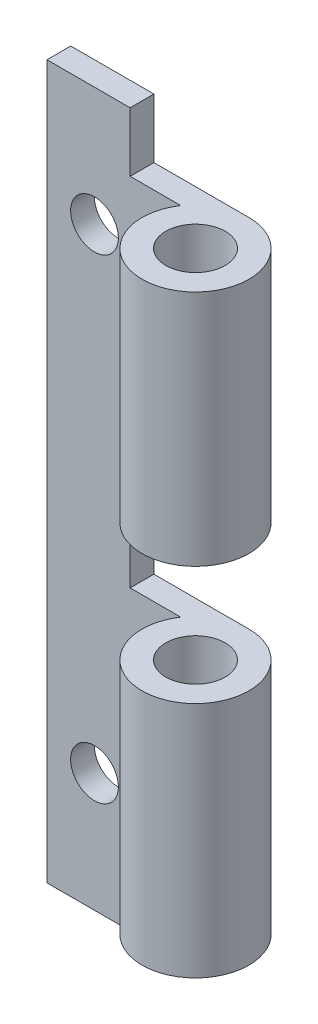
ISO-10303-21;
HEADER;
FILE_DESCRIPTION(('STEP AP214'),'2;1');
FILE_NAME('part.step','',(''),(''),'','','');
FILE_SCHEMA(('AUTOMOTIVE_DESIGN { 1 0 10303 214 1 1 1 1 }'));
ENDSEC;
DATA;
#1=APPLICATION_CONTEXT('core data for automotive mechanical design processes');
#2=APPLICATION_PROTOCOL_DEFINITION('international standard','automotive_design',2000,#1);
#3=PRODUCT_CONTEXT('',#1,'mechanical');
#4=PRODUCT('Part','Part','',(#3));
#5=PRODUCT_RELATED_PRODUCT_CATEGORY('part','',(#4));
#6=PRODUCT_DEFINITION_FORMATION('','',#4);
#7=PRODUCT_DEFINITION_CONTEXT('part definition',#1,'design');
#8=PRODUCT_DEFINITION('design','',#6,#7);
#9=PRODUCT_DEFINITION_SHAPE('','',#8);
#10=(LENGTH_UNIT() NAMED_UNIT(*) SI_UNIT(.MILLI.,.METRE.));
#11=(NAMED_UNIT(*) PLANE_ANGLE_UNIT() SI_UNIT($,.RADIAN.));
#12=(NAMED_UNIT(*) SI_UNIT($,.STERADIAN.) SOLID_ANGLE_UNIT());
#13=UNCERTAINTY_MEASURE_WITH_UNIT(LENGTH_MEASURE(1.E-05),#10,'distance_accuracy_value','');
#14=(GEOMETRIC_REPRESENTATION_CONTEXT(3) GLOBAL_UNCERTAINTY_ASSIGNED_CONTEXT((#13)) GLOBAL_UNIT_ASSIGNED_CONTEXT((#10,
#11,#12)) REPRESENTATION_CONTEXT('',''));
#15=CARTESIAN_POINT('',(0.,0.,0.));
#16=DIRECTION('',(0.,0.,1.));
#17=DIRECTION('',(1.,0.,0.));
#18=AXIS2_PLACEMENT_3D('',#15,#16,#17);
#19=CARTESIAN_POINT('',(0.,0.,0.));
#20=DIRECTION('',(0.,0.,1.));
#21=DIRECTION('',(1.,0.,0.));
#22=AXIS2_PLACEMENT_3D('',#19,#20,#21);
#23=PLANE('',#22);
#24=DIRECTION('',(1.,0.,0.));
#25=VECTOR('',#24,1.);
#26=CARTESIAN_POINT('',(-10.16,6.35,0.));
#27=LINE('',#26,#25);
#28=CARTESIAN_POINT('',(-10.16,6.35,0.));
#29=VERTEX_POINT('',#28);
#30=CARTESIAN_POINT('',(0.,6.35,0.));
#31=VERTEX_POINT('',#30);
#32=EDGE_CURVE('E142',#29,#31,#27,.T.);
#33=ORIENTED_EDGE('',*,*,#32,.F.);
#34=DIRECTION('',(0.,1.,0.));
#35=VECTOR('',#34,1.);
#36=CARTESIAN_POINT('',(-10.16,6.35,0.));
#37=LINE('',#36,#35);
#38=CARTESIAN_POINT('',(-10.16,0.,0.));
#39=VERTEX_POINT('',#38);
#40=EDGE_CURVE('E150',#39,#29,#37,.T.);
#41=ORIENTED_EDGE('',*,*,#40,.F.);
#42=DIRECTION('',(1.,0.,0.));
#43=VECTOR('',#42,1.);
#44=CARTESIAN_POINT('',(0.,0.,0.));
#45=LINE('',#44,#43);
#46=CARTESIAN_POINT('',(-19.05,0.,0.));
#47=VERTEX_POINT('',#46);
#48=EDGE_CURVE('E241',#47,#39,#45,.T.);
#49=ORIENTED_EDGE('',*,*,#48,.F.);
#50=DIRECTION('',(0.,-1.,0.));
#51=VECTOR('',#50,1.);
#52=CARTESIAN_POINT('',(-19.05,0.,0.));
#53=LINE('',#52,#51);
#54=CARTESIAN_POINT('',(-19.05,76.2,0.));
#55=VERTEX_POINT('',#54);
#56=EDGE_CURVE('E253',#55,#47,#53,.T.);
#57=ORIENTED_EDGE('',*,*,#56,.F.);
#58=DIRECTION('',(-1.,0.,0.));
#59=VECTOR('',#58,1.);
#60=CARTESIAN_POINT('',(0.,76.2,0.));
#61=LINE('',#60,#59);
#62=CARTESIAN_POINT('',(-10.16,76.2,0.));
#63=VERTEX_POINT('',#62);
#64=EDGE_CURVE('E70',#63,#55,#61,.T.);
#65=ORIENTED_EDGE('',*,*,#64,.F.);
#66=DIRECTION('',(0.,1.,0.));
#67=VECTOR('',#66,1.);
#68=CARTESIAN_POINT('',(-10.16,69.85,0.));
#69=LINE('',#68,#67);
#70=CARTESIAN_POINT('',(-10.16,69.85,0.));
#71=VERTEX_POINT('',#70);
#72=EDGE_CURVE('E169',#71,#63,#69,.T.);
#73=ORIENTED_EDGE('',*,*,#72,.F.);
#74=DIRECTION('',(-1.,0.,0.));
#75=VECTOR('',#74,1.);
#76=CARTESIAN_POINT('',(-10.16,69.85,0.));
#77=LINE('',#76,#75);
#78=CARTESIAN_POINT('',(0.,69.85,0.));
#79=VERTEX_POINT('',#78);
#80=EDGE_CURVE('E172',#79,#71,#77,.T.);
#81=ORIENTED_EDGE('',*,*,#80,.F.);
#82=DIRECTION('',(0.,1.,0.));
#83=VECTOR('',#82,1.);
#84=CARTESIAN_POINT('',(0.,0.,0.));
#85=LINE('',#84,#83);
#86=CARTESIAN_POINT('',(0.,44.45,0.));
#87=VERTEX_POINT('',#86);
#88=EDGE_CURVE('E247',#87,#79,#85,.T.);
#89=ORIENTED_EDGE('',*,*,#88,.F.);
#90=DIRECTION('',(1.,0.,0.));
#91=VECTOR('',#90,1.);
#92=CARTESIAN_POINT('',(-10.16,44.45,0.));
#93=LINE('',#92,#91);
#94=CARTESIAN_POINT('',(-10.16,44.45,0.));
#95=VERTEX_POINT('',#94);
#96=EDGE_CURVE('E186',#95,#87,#93,.T.);
#97=ORIENTED_EDGE('',*,*,#96,.F.);
#98=DIRECTION('',(0.,1.,0.));
#99=VECTOR('',#98,1.);
#100=CARTESIAN_POINT('',(-10.16,31.75,0.));
#101=LINE('',#100,#99);
#102=CARTESIAN_POINT('',(-10.16,31.75,0.));
#103=VERTEX_POINT('',#102);
#104=EDGE_CURVE('E182',#103,#95,#101,.T.);
#105=ORIENTED_EDGE('',*,*,#104,.F.);
#106=DIRECTION('',(-1.,0.,0.));
#107=VECTOR('',#106,1.);
#108=CARTESIAN_POINT('',(-10.16,31.75,0.));
#109=LINE('',#108,#107);
#110=CARTESIAN_POINT('',(0.,31.75,0.));
#111=VERTEX_POINT('',#110);
#112=EDGE_CURVE('E191',#111,#103,#109,.T.);
#113=ORIENTED_EDGE('',*,*,#112,.F.);
#114=EDGE_CURVE('E161',#31,#111,#85,.T.);
#115=ORIENTED_EDGE('',*,*,#114,.F.);
#116=EDGE_LOOP('',(#33,#41,#49,#57,#65,#73,#81,#89,#97,#105,#113,#115));
#117=FACE_BOUND('',#116,.T.);
#118=CARTESIAN_POINT('',(-13.97,12.7,0.));
#119=DIRECTION('',(0.,0.,1.));
#120=DIRECTION('',(1.,0.,0.));
#121=AXIS2_PLACEMENT_3D('',#118,#119,#120);
#122=CIRCLE('',#121,2.55269999999999);
#123=CARTESIAN_POINT('',(-11.4173,12.7,0.));
#124=VERTEX_POINT('',#123);
#125=EDGE_CURVE('E187',#124,#124,#122,.F.);
#126=ORIENTED_EDGE('',*,*,#125,.F.);
#127=EDGE_LOOP('',(#126));
#128=FACE_BOUND('',#127,.T.);
#129=CARTESIAN_POINT('',(-13.97,63.5,0.));
#130=DIRECTION('',(0.,0.,1.));
#131=DIRECTION('',(1.,0.,0.));
#132=AXIS2_PLACEMENT_3D('',#129,#130,#131);
#133=CIRCLE('',#132,2.55269999999999);
#134=CARTESIAN_POINT('',(-11.4173,63.5,0.));
#135=VERTEX_POINT('',#134);
#136=EDGE_CURVE('E356',#135,#135,#133,.F.);
#137=ORIENTED_EDGE('',*,*,#136,.F.);
#138=EDGE_LOOP('',(#137));
#139=FACE_BOUND('',#138,.T.);
#140=ADVANCED_FACE('F39',(#117,#128,#139),#23,.F.);
#141=CARTESIAN_POINT('',(0.,92.3644610179245,5.715));
#142=DIRECTION('',(0.,-1.,0.));
#143=DIRECTION('',(0.,0.,-1.));
#144=AXIS2_PLACEMENT_3D('',#141,#142,#143);
#145=CYLINDRICAL_SURFACE('',#144,5.715);
#146=CARTESIAN_POINT('',(0.,69.85,5.715));
#147=DIRECTION('',(0.,-1.,0.));
#148=DIRECTION('',(0.,0.,-1.));
#149=AXIS2_PLACEMENT_3D('',#146,#147,#148);
#150=CIRCLE('',#149,5.715);
#151=CARTESIAN_POINT('',(-4.7519048812029,69.85,2.54));
#152=VERTEX_POINT('',#151);
#153=EDGE_CURVE('E214',#152,#79,#150,.F.);
#154=ORIENTED_EDGE('',*,*,#153,.F.);
#155=DIRECTION('',(0.,-1.,0.));
#156=VECTOR('',#155,1.);
#157=CARTESIAN_POINT('',(-4.7519048812029,92.3644610179245,2.54));
#158=LINE('',#157,#156);
#159=CARTESIAN_POINT('',(-4.7519048812029,44.45,2.54));
#160=VERTEX_POINT('',#159);
#161=EDGE_CURVE('E237',#152,#160,#158,.T.);
#162=ORIENTED_EDGE('',*,*,#161,.T.);
#163=CARTESIAN_POINT('',(0.,44.45,5.715));
#164=DIRECTION('',(0.,1.,0.));
#165=DIRECTION('',(-1.,0.,0.));
#166=AXIS2_PLACEMENT_3D('',#163,#164,#165);
#167=CIRCLE('',#166,5.715);
#168=EDGE_CURVE('E200',#87,#160,#167,.F.);
#169=ORIENTED_EDGE('',*,*,#168,.F.);
#170=ORIENTED_EDGE('',*,*,#88,.T.);
#171=EDGE_LOOP('',(#154,#162,#169,#170));
#172=FACE_BOUND('',#171,.T.);
#173=ADVANCED_FACE('F290',(#172),#145,.T.);
#174=CARTESIAN_POINT('',(0.,76.2,2.54));
#175=DIRECTION('',(0.,-1.,0.));
#176=DIRECTION('',(1.,0.,0.));
#177=AXIS2_PLACEMENT_3D('',#174,#175,#176);
#178=PLANE('',#177);
#179=DIRECTION('',(-1.,0.,0.));
#180=VECTOR('',#179,1.);
#181=CARTESIAN_POINT('',(0.,76.2,2.54));
#182=LINE('',#181,#180);
#183=CARTESIAN_POINT('',(-10.16,76.2,2.54));
#184=VERTEX_POINT('',#183);
#185=CARTESIAN_POINT('',(-19.05,76.2,2.54));
#186=VERTEX_POINT('',#185);
#187=EDGE_CURVE('E238',#184,#186,#182,.T.);
#188=ORIENTED_EDGE('',*,*,#187,.F.);
#189=DIRECTION('',(0.,0.,-1.));
#190=VECTOR('',#189,1.);
#191=CARTESIAN_POINT('',(-10.16,76.2,11.43));
#192=LINE('',#191,#190);
#193=EDGE_CURVE('E177',#184,#63,#192,.T.);
#194=ORIENTED_EDGE('',*,*,#193,.T.);
#195=ORIENTED_EDGE('',*,*,#64,.T.);
#196=DIRECTION('',(0.,0.,-1.));
#197=VECTOR('',#196,1.);
#198=CARTESIAN_POINT('',(-19.05,76.2,2.54));
#199=LINE('',#198,#197);
#200=EDGE_CURVE('E11',#186,#55,#199,.T.);
#201=ORIENTED_EDGE('',*,*,#200,.F.);
#202=EDGE_LOOP('',(#188,#194,#195,#201));
#203=FACE_BOUND('',#202,.T.);
#204=ADVANCED_FACE('F41',(#203),#178,.F.);
#205=CARTESIAN_POINT('',(-19.05,0.,2.54));
#206=DIRECTION('',(1.,0.,0.));
#207=DIRECTION('',(0.,0.,-1.));
#208=AXIS2_PLACEMENT_3D('',#205,#206,#207);
#209=PLANE('',#208);
#210=ORIENTED_EDGE('',*,*,#56,.T.);
#211=DIRECTION('',(0.,0.,-1.));
#212=VECTOR('',#211,1.);
#213=CARTESIAN_POINT('',(-19.05,0.,2.54));
#214=LINE('',#213,#212);
#215=CARTESIAN_POINT('',(-19.05,0.,2.54));
#216=VERTEX_POINT('',#215);
#217=EDGE_CURVE('E50',#216,#47,#214,.T.);
#218=ORIENTED_EDGE('',*,*,#217,.F.);
#219=DIRECTION('',(0.,-1.,0.));
#220=VECTOR('',#219,1.);
#221=CARTESIAN_POINT('',(-19.05,0.,2.54));
#222=LINE('',#221,#220);
#223=EDGE_CURVE('E59',#186,#216,#222,.T.);
#224=ORIENTED_EDGE('',*,*,#223,.F.);
#225=ORIENTED_EDGE('',*,*,#200,.T.);
#226=EDGE_LOOP('',(#210,#218,#224,#225));
#227=FACE_BOUND('',#226,.T.);
#228=ADVANCED_FACE('F303',(#227),#209,.F.);
#229=CARTESIAN_POINT('',(0.,0.,2.54));
#230=DIRECTION('',(0.,1.,0.));
#231=DIRECTION('',(-1.,0.,0.));
#232=AXIS2_PLACEMENT_3D('',#229,#230,#231);
#233=PLANE('',#232);
#234=ORIENTED_EDGE('',*,*,#48,.T.);
#235=DIRECTION('',(0.,0.,-1.));
#236=VECTOR('',#235,1.);
#237=CARTESIAN_POINT('',(-10.16,0.,11.43));
#238=LINE('',#237,#236);
#239=CARTESIAN_POINT('',(-10.16,0.,2.54));
#240=VERTEX_POINT('',#239);
#241=EDGE_CURVE('E147',#240,#39,#238,.T.);
#242=ORIENTED_EDGE('',*,*,#241,.F.);
#243=DIRECTION('',(1.,0.,0.));
#244=VECTOR('',#243,1.);
#245=CARTESIAN_POINT('',(0.,0.,2.54));
#246=LINE('',#245,#244);
#247=EDGE_CURVE('E244',#216,#240,#246,.T.);
#248=ORIENTED_EDGE('',*,*,#247,.F.);
#249=ORIENTED_EDGE('',*,*,#217,.T.);
#250=EDGE_LOOP('',(#234,#242,#248,#249));
#251=FACE_BOUND('',#250,.T.);
#252=ADVANCED_FACE('F301',(#251),#233,.F.);
#253=CARTESIAN_POINT('',(0.,0.,2.54));
#254=DIRECTION('',(0.,0.,1.));
#255=DIRECTION('',(1.,0.,0.));
#256=AXIS2_PLACEMENT_3D('',#253,#254,#255);
#257=PLANE('',#256);
#258=CARTESIAN_POINT('',(-13.97,63.5,2.54));
#259=DIRECTION('',(0.,0.,1.));
#260=DIRECTION('',(1.,0.,0.));
#261=AXIS2_PLACEMENT_3D('',#258,#259,#260);
#262=CIRCLE('',#261,2.55269999999999);
#263=CARTESIAN_POINT('',(-11.4173,63.5,2.54));
#264=VERTEX_POINT('',#263);
#265=EDGE_CURVE('E359',#264,#264,#262,.T.);
#266=ORIENTED_EDGE('',*,*,#265,.F.);
#267=EDGE_LOOP('',(#266));
#268=FACE_BOUND('',#267,.T.);
#269=CARTESIAN_POINT('',(-13.97,12.7,2.54));
#270=DIRECTION('',(0.,0.,1.));
#271=DIRECTION('',(1.,0.,0.));
#272=AXIS2_PLACEMENT_3D('',#269,#270,#271);
#273=CIRCLE('',#272,2.55269999999999);
#274=CARTESIAN_POINT('',(-11.4173,12.7,2.54));
#275=VERTEX_POINT('',#274);
#276=EDGE_CURVE('E364',#275,#275,#273,.T.);
#277=ORIENTED_EDGE('',*,*,#276,.F.);
#278=EDGE_LOOP('',(#277));
#279=FACE_BOUND('',#278,.T.);
#280=DIRECTION('',(0.,-1.,0.));
#281=VECTOR('',#280,1.);
#282=CARTESIAN_POINT('',(-10.16,0.,2.54));
#283=LINE('',#282,#281);
#284=CARTESIAN_POINT('',(-10.16,6.35,2.54));
#285=VERTEX_POINT('',#284);
#286=EDGE_CURVE('E78',#285,#240,#283,.T.);
#287=ORIENTED_EDGE('',*,*,#286,.F.);
#288=DIRECTION('',(-1.,0.,0.));
#289=VECTOR('',#288,1.);
#290=CARTESIAN_POINT('',(0.,6.35,2.54));
#291=LINE('',#290,#289);
#292=CARTESIAN_POINT('',(-4.7519048812029,6.35,2.54));
#293=VERTEX_POINT('',#292);
#294=EDGE_CURVE('E145',#293,#285,#291,.T.);
#295=ORIENTED_EDGE('',*,*,#294,.F.);
#296=CARTESIAN_POINT('',(-4.7519048812029,31.75,2.54));
#297=VERTEX_POINT('',#296);
#298=EDGE_CURVE('E233',#297,#293,#158,.T.);
#299=ORIENTED_EDGE('',*,*,#298,.F.);
#300=DIRECTION('',(1.,0.,0.));
#301=VECTOR('',#300,1.);
#302=CARTESIAN_POINT('',(0.,31.75,2.54));
#303=LINE('',#302,#301);
#304=CARTESIAN_POINT('',(-10.16,31.75,2.54));
#305=VERTEX_POINT('',#304);
#306=EDGE_CURVE('E210',#305,#297,#303,.T.);
#307=ORIENTED_EDGE('',*,*,#306,.F.);
#308=DIRECTION('',(0.,-1.,0.));
#309=VECTOR('',#308,1.);
#310=CARTESIAN_POINT('',(-10.16,0.,2.54));
#311=LINE('',#310,#309);
#312=CARTESIAN_POINT('',(-10.16,44.45,2.54));
#313=VERTEX_POINT('',#312);
#314=EDGE_CURVE('E225',#313,#305,#311,.T.);
#315=ORIENTED_EDGE('',*,*,#314,.F.);
#316=DIRECTION('',(-1.,0.,0.));
#317=VECTOR('',#316,1.);
#318=CARTESIAN_POINT('',(0.,44.45,2.54));
#319=LINE('',#318,#317);
#320=EDGE_CURVE('E203',#160,#313,#319,.T.);
#321=ORIENTED_EDGE('',*,*,#320,.F.);
#322=ORIENTED_EDGE('',*,*,#161,.F.);
#323=DIRECTION('',(1.,0.,0.));
#324=VECTOR('',#323,1.);
#325=CARTESIAN_POINT('',(0.,69.85,2.54));
#326=LINE('',#325,#324);
#327=CARTESIAN_POINT('',(-10.16,69.85,2.54));
#328=VERTEX_POINT('',#327);
#329=EDGE_CURVE('E217',#328,#152,#326,.T.);
#330=ORIENTED_EDGE('',*,*,#329,.F.);
#331=DIRECTION('',(0.,-1.,0.));
#332=VECTOR('',#331,1.);
#333=CARTESIAN_POINT('',(-10.16,0.,2.54));
#334=LINE('',#333,#332);
#335=EDGE_CURVE('E228',#184,#328,#334,.T.);
#336=ORIENTED_EDGE('',*,*,#335,.F.);
#337=ORIENTED_EDGE('',*,*,#187,.T.);
#338=ORIENTED_EDGE('',*,*,#223,.T.);
#339=ORIENTED_EDGE('',*,*,#247,.T.);
#340=EDGE_LOOP('',(#287,#295,#299,#307,#315,#321,#322,#330,#336,#337,#338,#339));
#341=FACE_BOUND('',#340,.T.);
#342=ADVANCED_FACE('F300',(#268,#279,#341),#257,.T.);
#343=CARTESIAN_POINT('',(0.,6.34999999999999,5.715));
#344=DIRECTION('',(0.,1.,0.));
#345=DIRECTION('',(-1.,0.,0.));
#346=AXIS2_PLACEMENT_3D('',#343,#344,#345);
#347=CIRCLE('',#346,5.715);
#348=EDGE_CURVE('E220',#31,#293,#347,.F.);
#349=ORIENTED_EDGE('',*,*,#348,.F.);
#350=ORIENTED_EDGE('',*,*,#114,.T.);
#351=CARTESIAN_POINT('',(0.,31.75,5.715));
#352=DIRECTION('',(0.,-1.,0.));
#353=DIRECTION('',(1.,0.,0.));
#354=AXIS2_PLACEMENT_3D('',#351,#352,#353);
#355=CIRCLE('',#354,5.715);
#356=EDGE_CURVE('E207',#297,#111,#355,.F.);
#357=ORIENTED_EDGE('',*,*,#356,.F.);
#358=ORIENTED_EDGE('',*,*,#298,.T.);
#359=EDGE_LOOP('',(#349,#350,#357,#358));
#360=FACE_BOUND('',#359,.T.);
#361=ADVANCED_FACE('F297',(#360),#145,.T.);
#362=CARTESIAN_POINT('',(-10.16,31.75,11.43));
#363=DIRECTION('',(0.,-1.,0.));
#364=DIRECTION('',(1.,0.,0.));
#365=AXIS2_PLACEMENT_3D('',#362,#363,#364);
#366=PLANE('',#365);
#367=ORIENTED_EDGE('',*,*,#306,.T.);
#368=ORIENTED_EDGE('',*,*,#356,.T.);
#369=ORIENTED_EDGE('',*,*,#112,.T.);
#370=DIRECTION('',(0.,0.,-1.));
#371=VECTOR('',#370,1.);
#372=CARTESIAN_POINT('',(-10.16,31.75,11.43));
#373=LINE('',#372,#371);
#374=EDGE_CURVE('E173',#305,#103,#373,.T.);
#375=ORIENTED_EDGE('',*,*,#374,.F.);
#376=EDGE_LOOP('',(#367,#368,#369,#375));
#377=FACE_BOUND('',#376,.T.);
#378=CARTESIAN_POINT('',(0.,31.75,5.715));
#379=DIRECTION('',(0.,-1.,0.));
#380=DIRECTION('',(1.,0.,0.));
#381=AXIS2_PLACEMENT_3D('',#378,#379,#380);
#382=CIRCLE('',#381,3.175);
#383=CARTESIAN_POINT('',(3.175,31.75,5.715));
#384=VERTEX_POINT('',#383);
#385=EDGE_CURVE('E206',#384,#384,#382,.F.);
#386=ORIENTED_EDGE('',*,*,#385,.F.);
#387=EDGE_LOOP('',(#386));
#388=FACE_BOUND('',#387,.T.);
#389=ADVANCED_FACE('F317',(#377,#388),#366,.F.);
#390=CARTESIAN_POINT('',(-10.16,44.45,11.43));
#391=DIRECTION('',(0.,1.,0.));
#392=DIRECTION('',(-1.,0.,0.));
#393=AXIS2_PLACEMENT_3D('',#390,#391,#392);
#394=PLANE('',#393);
#395=ORIENTED_EDGE('',*,*,#320,.T.);
#396=DIRECTION('',(0.,0.,-1.));
#397=VECTOR('',#396,1.);
#398=CARTESIAN_POINT('',(-10.16,44.45,11.43));
#399=LINE('',#398,#397);
#400=EDGE_CURVE('E195',#313,#95,#399,.T.);
#401=ORIENTED_EDGE('',*,*,#400,.T.);
#402=ORIENTED_EDGE('',*,*,#96,.T.);
#403=ORIENTED_EDGE('',*,*,#168,.T.);
#404=EDGE_LOOP('',(#395,#401,#402,#403));
#405=FACE_BOUND('',#404,.T.);
#406=CARTESIAN_POINT('',(0.,44.45,5.715));
#407=DIRECTION('',(0.,1.,0.));
#408=DIRECTION('',(-1.,0.,0.));
#409=AXIS2_PLACEMENT_3D('',#406,#407,#408);
#410=CIRCLE('',#409,3.175);
#411=CARTESIAN_POINT('',(-3.175,44.45,5.715));
#412=VERTEX_POINT('',#411);
#413=EDGE_CURVE('E167',#412,#412,#410,.F.);
#414=ORIENTED_EDGE('',*,*,#413,.F.);
#415=EDGE_LOOP('',(#414));
#416=FACE_BOUND('',#415,.T.);
#417=ADVANCED_FACE('F381',(#405,#416),#394,.F.);
#418=CARTESIAN_POINT('',(-10.16,31.75,11.43));
#419=DIRECTION('',(-1.,0.,0.));
#420=DIRECTION('',(0.,0.,1.));
#421=AXIS2_PLACEMENT_3D('',#418,#419,#420);
#422=PLANE('',#421);
#423=ORIENTED_EDGE('',*,*,#314,.T.);
#424=ORIENTED_EDGE('',*,*,#374,.T.);
#425=ORIENTED_EDGE('',*,*,#104,.T.);
#426=ORIENTED_EDGE('',*,*,#400,.F.);
#427=EDGE_LOOP('',(#423,#424,#425,#426));
#428=FACE_BOUND('',#427,.T.);
#429=ADVANCED_FACE('F285',(#428),#422,.F.);
#430=CARTESIAN_POINT('',(0.,92.3644610179245,5.715));
#431=DIRECTION('',(0.,-1.,0.));
#432=DIRECTION('',(0.,0.,-1.));
#433=AXIS2_PLACEMENT_3D('',#430,#431,#432);
#434=CYLINDRICAL_SURFACE('',#433,3.175);
#435=CARTESIAN_POINT('',(0.,6.34999999999999,5.715));
#436=DIRECTION('',(0.,1.,0.));
#437=DIRECTION('',(-1.,0.,0.));
#438=AXIS2_PLACEMENT_3D('',#435,#436,#437);
#439=CIRCLE('',#438,3.175);
#440=CARTESIAN_POINT('',(-3.175,6.34999999999999,5.715));
#441=VERTEX_POINT('',#440);
#442=EDGE_CURVE('E43',#441,#441,#439,.F.);
#443=ORIENTED_EDGE('',*,*,#442,.T.);
#444=EDGE_LOOP('',(#443));
#445=FACE_BOUND('',#444,.T.);
#446=ORIENTED_EDGE('',*,*,#385,.T.);
#447=EDGE_LOOP('',(#446));
#448=FACE_BOUND('',#447,.T.);
#449=ADVANCED_FACE('F276',(#445,#448),#434,.F.);
#450=CARTESIAN_POINT('',(-10.16,69.85,11.43));
#451=DIRECTION('',(0.,-1.,0.));
#452=DIRECTION('',(0.,0.,-1.));
#453=AXIS2_PLACEMENT_3D('',#450,#451,#452);
#454=PLANE('',#453);
#455=ORIENTED_EDGE('',*,*,#329,.T.);
#456=ORIENTED_EDGE('',*,*,#153,.T.);
#457=ORIENTED_EDGE('',*,*,#80,.T.);
#458=DIRECTION('',(0.,0.,-1.));
#459=VECTOR('',#458,1.);
#460=CARTESIAN_POINT('',(-10.16,69.85,11.43));
#461=LINE('',#460,#459);
#462=EDGE_CURVE('E156',#328,#71,#461,.T.);
#463=ORIENTED_EDGE('',*,*,#462,.F.);
#464=EDGE_LOOP('',(#455,#456,#457,#463));
#465=FACE_BOUND('',#464,.T.);
#466=CARTESIAN_POINT('',(0.,69.85,5.715));
#467=DIRECTION('',(0.,-1.,0.));
#468=DIRECTION('',(0.,0.,-1.));
#469=AXIS2_PLACEMENT_3D('',#466,#467,#468);
#470=CIRCLE('',#469,3.175);
#471=CARTESIAN_POINT('',(0.,69.85,2.54));
#472=VERTEX_POINT('',#471);
#473=EDGE_CURVE('E213',#472,#472,#470,.F.);
#474=ORIENTED_EDGE('',*,*,#473,.F.);
#475=EDGE_LOOP('',(#474));
#476=FACE_BOUND('',#475,.T.);
#477=ADVANCED_FACE('F273',(#465,#476),#454,.F.);
#478=CARTESIAN_POINT('',(-10.16,69.85,11.43));
#479=DIRECTION('',(-1.,0.,0.));
#480=DIRECTION('',(0.,0.,1.));
#481=AXIS2_PLACEMENT_3D('',#478,#479,#480);
#482=PLANE('',#481);
#483=ORIENTED_EDGE('',*,*,#335,.T.);
#484=ORIENTED_EDGE('',*,*,#462,.T.);
#485=ORIENTED_EDGE('',*,*,#72,.T.);
#486=ORIENTED_EDGE('',*,*,#193,.F.);
#487=EDGE_LOOP('',(#483,#484,#485,#486));
#488=FACE_BOUND('',#487,.T.);
#489=ADVANCED_FACE('F275',(#488),#482,.F.);
#490=CARTESIAN_POINT('',(-10.16,6.35,11.43));
#491=DIRECTION('',(0.,1.,0.));
#492=DIRECTION('',(-1.,0.,0.));
#493=AXIS2_PLACEMENT_3D('',#490,#491,#492);
#494=PLANE('',#493);
#495=ORIENTED_EDGE('',*,*,#294,.T.);
#496=DIRECTION('',(0.,0.,-1.));
#497=VECTOR('',#496,1.);
#498=CARTESIAN_POINT('',(-10.16,6.35,11.43));
#499=LINE('',#498,#497);
#500=EDGE_CURVE('E137',#285,#29,#499,.T.);
#501=ORIENTED_EDGE('',*,*,#500,.T.);
#502=ORIENTED_EDGE('',*,*,#32,.T.);
#503=ORIENTED_EDGE('',*,*,#348,.T.);
#504=EDGE_LOOP('',(#495,#501,#502,#503));
#505=FACE_BOUND('',#504,.T.);
#506=ORIENTED_EDGE('',*,*,#442,.F.);
#507=EDGE_LOOP('',(#506));
#508=FACE_BOUND('',#507,.T.);
#509=ADVANCED_FACE('F139',(#505,#508),#494,.F.);
#510=CARTESIAN_POINT('',(-10.16,6.35,11.43));
#511=DIRECTION('',(-1.,0.,0.));
#512=DIRECTION('',(0.,-1.,0.));
#513=AXIS2_PLACEMENT_3D('',#510,#511,#512);
#514=PLANE('',#513);
#515=ORIENTED_EDGE('',*,*,#286,.T.);
#516=ORIENTED_EDGE('',*,*,#241,.T.);
#517=ORIENTED_EDGE('',*,*,#40,.T.);
#518=ORIENTED_EDGE('',*,*,#500,.F.);
#519=EDGE_LOOP('',(#515,#516,#517,#518));
#520=FACE_BOUND('',#519,.T.);
#521=ADVANCED_FACE('F151',(#520),#514,.F.);
#522=ORIENTED_EDGE('',*,*,#473,.T.);
#523=EDGE_LOOP('',(#522));
#524=FACE_BOUND('',#523,.T.);
#525=ORIENTED_EDGE('',*,*,#413,.T.);
#526=EDGE_LOOP('',(#525));
#527=FACE_BOUND('',#526,.T.);
#528=ADVANCED_FACE('F270',(#524,#527),#434,.F.);
#529=CARTESIAN_POINT('',(-13.97,12.7,2.54));
#530=DIRECTION('',(0.,0.,1.));
#531=DIRECTION('',(1.,0.,0.));
#532=AXIS2_PLACEMENT_3D('',#529,#530,#531);
#533=CYLINDRICAL_SURFACE('',#532,2.55269999999999);
#534=ORIENTED_EDGE('',*,*,#125,.T.);
#535=EDGE_LOOP('',(#534));
#536=FACE_BOUND('',#535,.T.);
#537=ORIENTED_EDGE('',*,*,#276,.T.);
#538=EDGE_LOOP('',(#537));
#539=FACE_BOUND('',#538,.T.);
#540=ADVANCED_FACE('F344',(#536,#539),#533,.F.);
#541=CARTESIAN_POINT('',(-13.97,63.5,2.54));
#542=DIRECTION('',(0.,0.,1.));
#543=DIRECTION('',(1.,0.,0.));
#544=AXIS2_PLACEMENT_3D('',#541,#542,#543);
#545=CYLINDRICAL_SURFACE('',#544,2.55269999999999);
#546=ORIENTED_EDGE('',*,*,#136,.T.);
#547=EDGE_LOOP('',(#546));
#548=FACE_BOUND('',#547,.T.);
#549=ORIENTED_EDGE('',*,*,#265,.T.);
#550=EDGE_LOOP('',(#549));
#551=FACE_BOUND('',#550,.T.);
#552=ADVANCED_FACE('F347',(#548,#551),#545,.F.);
#553=CLOSED_SHELL('',(#140,#173,#204,#228,#252,#342,#361,#389,#417,#429,#449,#477,#489,#509,
#521,#528,#540,#552));
#554=MANIFOLD_SOLID_BREP('B2',#553);
#555=ADVANCED_BREP_SHAPE_REPRESENTATION('',(#18,#554),#14);
#556=SHAPE_DEFINITION_REPRESENTATION(#9,#555);
ENDSEC;
END-ISO-10303-21;
